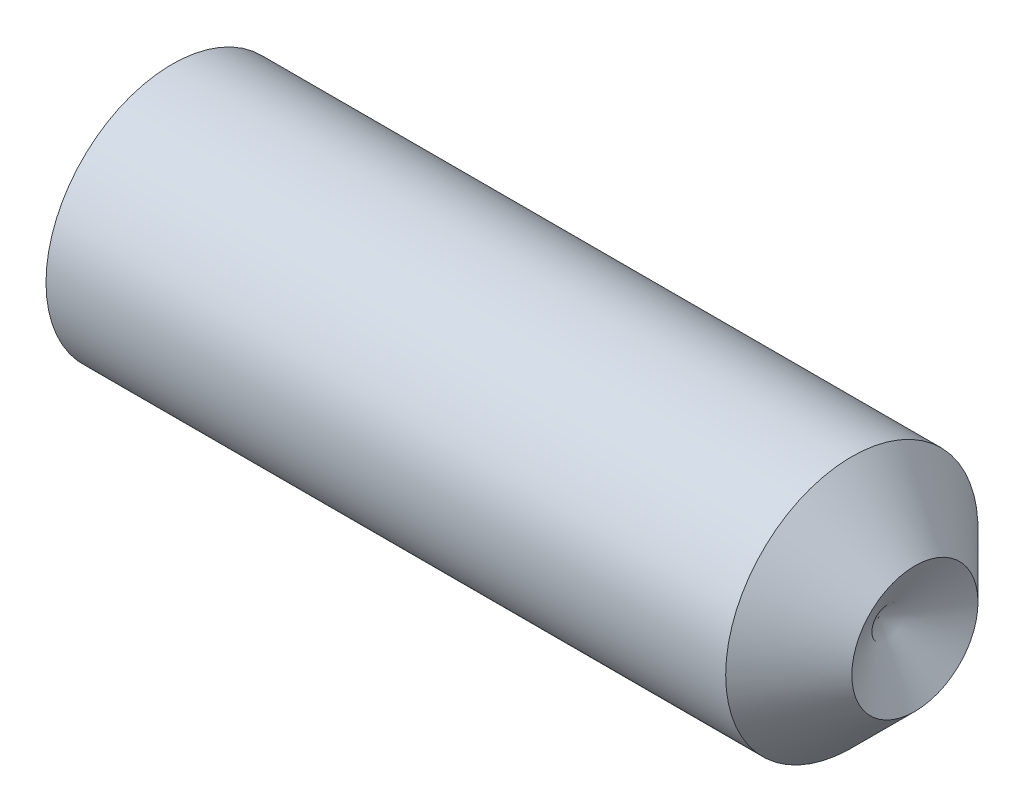
ISO-10303-21;
HEADER;
FILE_DESCRIPTION(('STEP AP214'),'2;1');
FILE_NAME('part.step','',(''),(''),'','','');
FILE_SCHEMA(('AUTOMOTIVE_DESIGN { 1 0 10303 214 1 1 1 1 }'));
ENDSEC;
DATA;
#1=APPLICATION_CONTEXT('core data for automotive mechanical design processes');
#2=APPLICATION_PROTOCOL_DEFINITION('international standard','automotive_design',2000,#1);
#3=PRODUCT_CONTEXT('',#1,'mechanical');
#4=PRODUCT('Part','Part','',(#3));
#5=PRODUCT_RELATED_PRODUCT_CATEGORY('part','',(#4));
#6=PRODUCT_DEFINITION_FORMATION('','',#4);
#7=PRODUCT_DEFINITION_CONTEXT('part definition',#1,'design');
#8=PRODUCT_DEFINITION('design','',#6,#7);
#9=PRODUCT_DEFINITION_SHAPE('','',#8);
#10=(LENGTH_UNIT() NAMED_UNIT(*) SI_UNIT(.MILLI.,.METRE.));
#11=(NAMED_UNIT(*) PLANE_ANGLE_UNIT() SI_UNIT($,.RADIAN.));
#12=(NAMED_UNIT(*) SI_UNIT($,.STERADIAN.) SOLID_ANGLE_UNIT());
#13=UNCERTAINTY_MEASURE_WITH_UNIT(LENGTH_MEASURE(1.E-05),#10,'distance_accuracy_value','');
#14=(GEOMETRIC_REPRESENTATION_CONTEXT(3) GLOBAL_UNCERTAINTY_ASSIGNED_CONTEXT((#13)) GLOBAL_UNIT_ASSIGNED_CONTEXT((#10,
#11,#12)) REPRESENTATION_CONTEXT('',''));
#15=CARTESIAN_POINT('',(0.,0.,0.));
#16=DIRECTION('',(0.,0.,1.));
#17=DIRECTION('',(1.,0.,0.));
#18=AXIS2_PLACEMENT_3D('',#15,#16,#17);
#19=CARTESIAN_POINT('',(0.,0.,0.));
#20=DIRECTION('',(-1.,0.,0.));
#21=DIRECTION('',(0.,0.,1.));
#22=AXIS2_PLACEMENT_3D('',#19,#20,#21);
#23=PLANE('',#22);
#24=CARTESIAN_POINT('',(0.,0.,0.));
#25=DIRECTION('',(-1.,0.,0.));
#26=DIRECTION('',(0.,0.,1.));
#27=AXIS2_PLACEMENT_3D('',#24,#25,#26);
#28=CIRCLE('',#27,1.61);
#29=CARTESIAN_POINT('',(0.,0.,1.61));
#30=VERTEX_POINT('',#29);
#31=EDGE_CURVE('E11',#30,#30,#28,.T.);
#32=ORIENTED_EDGE('',*,*,#31,.T.);
#33=EDGE_LOOP('',(#32));
#34=FACE_BOUND('',#33,.T.);
#35=DIRECTION('',(0.,0.,-1.));
#36=VECTOR('',#35,1.);
#37=CARTESIAN_POINT('',(0.,1.,0.577350269189623));
#38=LINE('',#37,#36);
#39=CARTESIAN_POINT('',(0.,1.,0.577350269189623));
#40=VERTEX_POINT('',#39);
#41=CARTESIAN_POINT('',(0.,1.,-0.577350269189629));
#42=VERTEX_POINT('',#41);
#43=EDGE_CURVE('E95',#40,#42,#38,.T.);
#44=ORIENTED_EDGE('',*,*,#43,.F.);
#45=DIRECTION('',(0.,-0.866025403784439,0.5));
#46=VECTOR('',#45,1.);
#47=CARTESIAN_POINT('',(0.,1.,0.577350269189623));
#48=LINE('',#47,#46);
#49=CARTESIAN_POINT('',(0.,0.,1.15470053837925));
#50=VERTEX_POINT('',#49);
#51=EDGE_CURVE('E48',#40,#50,#48,.T.);
#52=ORIENTED_EDGE('',*,*,#51,.T.);
#53=DIRECTION('',(0.,0.866025403784439,0.5));
#54=VECTOR('',#53,1.);
#55=CARTESIAN_POINT('',(0.,-0.999999999999997,0.577350269189623));
#56=LINE('',#55,#54);
#57=CARTESIAN_POINT('',(0.,-0.999999999999997,0.577350269189623));
#58=VERTEX_POINT('',#57);
#59=EDGE_CURVE('E101',#58,#50,#56,.T.);
#60=ORIENTED_EDGE('',*,*,#59,.F.);
#61=DIRECTION('',(0.,0.,-1.));
#62=VECTOR('',#61,1.);
#63=CARTESIAN_POINT('',(0.,-0.999999999999997,0.577350269189623));
#64=LINE('',#63,#62);
#65=CARTESIAN_POINT('',(0.,-0.999999999999997,-0.577350269189628));
#66=VERTEX_POINT('',#65);
#67=EDGE_CURVE('E121',#58,#66,#64,.T.);
#68=ORIENTED_EDGE('',*,*,#67,.T.);
#69=DIRECTION('',(0.,0.866025403784439,-0.5));
#70=VECTOR('',#69,1.);
#71=CARTESIAN_POINT('',(0.,-0.999999999999997,-0.577350269189628));
#72=LINE('',#71,#70);
#73=CARTESIAN_POINT('',(0.,0.,-1.15470053837925));
#74=VERTEX_POINT('',#73);
#75=EDGE_CURVE('E124',#66,#74,#72,.T.);
#76=ORIENTED_EDGE('',*,*,#75,.T.);
#77=DIRECTION('',(0.,-0.866025403784439,-0.499999999999999));
#78=VECTOR('',#77,1.);
#79=CARTESIAN_POINT('',(0.,1.,-0.577350269189629));
#80=LINE('',#79,#78);
#81=EDGE_CURVE('E127',#42,#74,#80,.T.);
#82=ORIENTED_EDGE('',*,*,#81,.F.);
#83=EDGE_LOOP('',(#44,#52,#60,#68,#76,#82));
#84=FACE_BOUND('',#83,.T.);
#85=ADVANCED_FACE('F34',(#34,#84),#23,.T.);
#86=CARTESIAN_POINT('',(0.,0.,0.));
#87=DIRECTION('',(1.,0.,0.));
#88=DIRECTION('',(0.,0.,-1.));
#89=AXIS2_PLACEMENT_3D('',#86,#87,#88);
#90=CONICAL_SURFACE('',#89,1.61,1.0471975511966);
#91=CARTESIAN_POINT('',(0.225166604983952,0.,0.));
#92=DIRECTION('',(-1.,0.,0.));
#93=DIRECTION('',(0.,0.,1.));
#94=AXIS2_PLACEMENT_3D('',#91,#92,#93);
#95=CIRCLE('',#94,2.);
#96=CARTESIAN_POINT('',(0.225166604983952,0.,2.));
#97=VERTEX_POINT('',#96);
#98=EDGE_CURVE('E41',#97,#97,#95,.T.);
#99=ORIENTED_EDGE('',*,*,#98,.T.);
#100=EDGE_LOOP('',(#99));
#101=FACE_BOUND('',#100,.T.);
#102=ORIENTED_EDGE('',*,*,#31,.F.);
#103=EDGE_LOOP('',(#102));
#104=FACE_BOUND('',#103,.T.);
#105=ADVANCED_FACE('F147',(#101,#104),#90,.T.);
#106=CARTESIAN_POINT('',(-12.7,0.,0.));
#107=DIRECTION('',(-1.,0.,0.));
#108=DIRECTION('',(0.,0.,1.));
#109=AXIS2_PLACEMENT_3D('',#106,#107,#108);
#110=CYLINDRICAL_SURFACE('',#109,2.);
#111=CARTESIAN_POINT('',(11.,0.,0.));
#112=DIRECTION('',(-1.,0.,0.));
#113=DIRECTION('',(0.,0.,1.));
#114=AXIS2_PLACEMENT_3D('',#111,#112,#113);
#115=CIRCLE('',#114,2.);
#116=CARTESIAN_POINT('',(11.,0.,2.));
#117=VERTEX_POINT('',#116);
#118=EDGE_CURVE('E142',#117,#117,#115,.T.);
#119=ORIENTED_EDGE('',*,*,#118,.T.);
#120=EDGE_LOOP('',(#119));
#121=FACE_BOUND('',#120,.T.);
#122=ORIENTED_EDGE('',*,*,#98,.F.);
#123=EDGE_LOOP('',(#122));
#124=FACE_BOUND('',#123,.T.);
#125=ADVANCED_FACE('F150',(#121,#124),#110,.T.);
#126=CARTESIAN_POINT('',(11.,0.,0.));
#127=DIRECTION('',(-1.,0.,0.));
#128=DIRECTION('',(0.,0.,1.));
#129=AXIS2_PLACEMENT_3D('',#126,#127,#128);
#130=CONICAL_SURFACE('',#129,2.,0.785398163397451);
#131=CARTESIAN_POINT('',(12.,0.,0.));
#132=DIRECTION('',(-1.,0.,0.));
#133=DIRECTION('',(0.,0.,1.));
#134=AXIS2_PLACEMENT_3D('',#131,#132,#133);
#135=CIRCLE('',#134,1.);
#136=CARTESIAN_POINT('',(12.,0.,1.));
#137=VERTEX_POINT('',#136);
#138=EDGE_CURVE('E102',#137,#137,#135,.T.);
#139=ORIENTED_EDGE('',*,*,#138,.T.);
#140=EDGE_LOOP('',(#139));
#141=FACE_BOUND('',#140,.T.);
#142=ORIENTED_EDGE('',*,*,#118,.F.);
#143=EDGE_LOOP('',(#142));
#144=FACE_BOUND('',#143,.T.);
#145=ADVANCED_FACE('F152',(#141,#144),#130,.T.);
#146=CARTESIAN_POINT('',(11.4226497308104,0.,0.));
#147=DIRECTION('',(1.,0.,0.));
#148=DIRECTION('',(0.,0.,-1.));
#149=AXIS2_PLACEMENT_3D('',#146,#147,#148);
#150=CONICAL_SURFACE('',#149,0.,1.04719755119659);
#151=ORIENTED_EDGE('',*,*,#138,.F.);
#152=EDGE_LOOP('',(#151));
#153=FACE_BOUND('',#152,.T.);
#154=CARTESIAN_POINT('',(11.4226497308104,0.,0.));
#155=VERTEX_POINT('',#154);
#156=VERTEX_LOOP('',#155);
#157=FACE_BOUND('',#156,.T.);
#158=ADVANCED_FACE('F159',(#153,#157),#150,.F.);
#159=CARTESIAN_POINT('',(2.5,1.,0.577350269189623));
#160=DIRECTION('',(0.,-0.5,-0.866025403784439));
#161=DIRECTION('',(0.,0.866025403784439,-0.5));
#162=AXIS2_PLACEMENT_3D('',#159,#160,#161);
#163=PLANE('',#162);
#164=ORIENTED_EDGE('',*,*,#51,.F.);
#165=DIRECTION('',(-1.,0.,0.));
#166=VECTOR('',#165,1.);
#167=CARTESIAN_POINT('',(2.5,1.,0.577350269189623));
#168=LINE('',#167,#166);
#169=CARTESIAN_POINT('',(2.5,1.,0.577350269189623));
#170=VERTEX_POINT('',#169);
#171=EDGE_CURVE('E89',#170,#40,#168,.T.);
#172=ORIENTED_EDGE('',*,*,#171,.F.);
#173=DIRECTION('',(0.,-0.866025403784439,0.5));
#174=VECTOR('',#173,1.);
#175=CARTESIAN_POINT('',(2.5,1.,0.577350269189623));
#176=LINE('',#175,#174);
#177=CARTESIAN_POINT('',(2.5,0.,1.15470053837925));
#178=VERTEX_POINT('',#177);
#179=EDGE_CURVE('E84',#170,#178,#176,.T.);
#180=ORIENTED_EDGE('',*,*,#179,.T.);
#181=DIRECTION('',(-1.,0.,0.));
#182=VECTOR('',#181,1.);
#183=CARTESIAN_POINT('',(2.5,0.,1.15470053837925));
#184=LINE('',#183,#182);
#185=EDGE_CURVE('E87',#178,#50,#184,.T.);
#186=ORIENTED_EDGE('',*,*,#185,.T.);
#187=EDGE_LOOP('',(#164,#172,#180,#186));
#188=FACE_BOUND('',#187,.T.);
#189=ADVANCED_FACE('F86',(#188),#163,.T.);
#190=CARTESIAN_POINT('',(2.5,-0.999999999999997,0.577350269189623));
#191=DIRECTION('',(0.,-0.5,0.866025403784439));
#192=DIRECTION('',(0.,-0.866025403784439,-0.5));
#193=AXIS2_PLACEMENT_3D('',#190,#191,#192);
#194=PLANE('',#193);
#195=ORIENTED_EDGE('',*,*,#59,.T.);
#196=ORIENTED_EDGE('',*,*,#185,.F.);
#197=DIRECTION('',(0.,0.866025403784439,0.5));
#198=VECTOR('',#197,1.);
#199=CARTESIAN_POINT('',(2.5,-0.999999999999997,0.577350269189623));
#200=LINE('',#199,#198);
#201=CARTESIAN_POINT('',(2.5,-0.999999999999997,0.577350269189623));
#202=VERTEX_POINT('',#201);
#203=EDGE_CURVE('E94',#202,#178,#200,.T.);
#204=ORIENTED_EDGE('',*,*,#203,.F.);
#205=DIRECTION('',(-1.,0.,0.));
#206=VECTOR('',#205,1.);
#207=CARTESIAN_POINT('',(2.5,-0.999999999999997,0.577350269189623));
#208=LINE('',#207,#206);
#209=EDGE_CURVE('E103',#202,#58,#208,.T.);
#210=ORIENTED_EDGE('',*,*,#209,.T.);
#211=EDGE_LOOP('',(#195,#196,#204,#210));
#212=FACE_BOUND('',#211,.T.);
#213=ADVANCED_FACE('F99',(#212),#194,.F.);
#214=CARTESIAN_POINT('',(2.5,-0.999999999999997,0.577350269189623));
#215=DIRECTION('',(0.,1.,0.));
#216=DIRECTION('',(0.,0.,1.));
#217=AXIS2_PLACEMENT_3D('',#214,#215,#216);
#218=PLANE('',#217);
#219=ORIENTED_EDGE('',*,*,#67,.F.);
#220=ORIENTED_EDGE('',*,*,#209,.F.);
#221=DIRECTION('',(0.,0.,-1.));
#222=VECTOR('',#221,1.);
#223=CARTESIAN_POINT('',(2.5,-0.999999999999997,0.577350269189623));
#224=LINE('',#223,#222);
#225=CARTESIAN_POINT('',(2.5,-0.999999999999997,-0.577350269189628));
#226=VERTEX_POINT('',#225);
#227=EDGE_CURVE('E108',#202,#226,#224,.T.);
#228=ORIENTED_EDGE('',*,*,#227,.T.);
#229=DIRECTION('',(-1.,0.,0.));
#230=VECTOR('',#229,1.);
#231=CARTESIAN_POINT('',(2.5,-0.999999999999997,-0.577350269189628));
#232=LINE('',#231,#230);
#233=EDGE_CURVE('E137',#226,#66,#232,.T.);
#234=ORIENTED_EDGE('',*,*,#233,.T.);
#235=EDGE_LOOP('',(#219,#220,#228,#234));
#236=FACE_BOUND('',#235,.T.);
#237=ADVANCED_FACE('F182',(#236),#218,.T.);
#238=CARTESIAN_POINT('',(2.5,-0.999999999999997,-0.577350269189628));
#239=DIRECTION('',(0.,0.5,0.866025403784439));
#240=DIRECTION('',(0.,-0.866025403784439,0.5));
#241=AXIS2_PLACEMENT_3D('',#238,#239,#240);
#242=PLANE('',#241);
#243=ORIENTED_EDGE('',*,*,#75,.F.);
#244=ORIENTED_EDGE('',*,*,#233,.F.);
#245=DIRECTION('',(0.,0.866025403784439,-0.5));
#246=VECTOR('',#245,1.);
#247=CARTESIAN_POINT('',(2.5,-0.999999999999997,-0.577350269189628));
#248=LINE('',#247,#246);
#249=CARTESIAN_POINT('',(2.5,0.,-1.15470053837925));
#250=VERTEX_POINT('',#249);
#251=EDGE_CURVE('E110',#226,#250,#248,.T.);
#252=ORIENTED_EDGE('',*,*,#251,.T.);
#253=DIRECTION('',(-1.,0.,0.));
#254=VECTOR('',#253,1.);
#255=CARTESIAN_POINT('',(2.5,0.,-1.15470053837925));
#256=LINE('',#255,#254);
#257=EDGE_CURVE('E135',#250,#74,#256,.T.);
#258=ORIENTED_EDGE('',*,*,#257,.T.);
#259=EDGE_LOOP('',(#243,#244,#252,#258));
#260=FACE_BOUND('',#259,.T.);
#261=ADVANCED_FACE('F178',(#260),#242,.T.);
#262=CARTESIAN_POINT('',(2.5,1.,-0.577350269189629));
#263=DIRECTION('',(0.,0.5,-0.866025403784439));
#264=DIRECTION('',(0.,0.866025403784439,0.5));
#265=AXIS2_PLACEMENT_3D('',#262,#263,#264);
#266=PLANE('',#265);
#267=ORIENTED_EDGE('',*,*,#81,.T.);
#268=ORIENTED_EDGE('',*,*,#257,.F.);
#269=DIRECTION('',(0.,-0.866025403784439,-0.499999999999999));
#270=VECTOR('',#269,1.);
#271=CARTESIAN_POINT('',(2.5,1.,-0.577350269189629));
#272=LINE('',#271,#270);
#273=CARTESIAN_POINT('',(2.5,1.,-0.577350269189629));
#274=VERTEX_POINT('',#273);
#275=EDGE_CURVE('E114',#274,#250,#272,.T.);
#276=ORIENTED_EDGE('',*,*,#275,.F.);
#277=DIRECTION('',(-1.,0.,0.));
#278=VECTOR('',#277,1.);
#279=CARTESIAN_POINT('',(2.5,1.,-0.577350269189629));
#280=LINE('',#279,#278);
#281=EDGE_CURVE('E133',#274,#42,#280,.T.);
#282=ORIENTED_EDGE('',*,*,#281,.T.);
#283=EDGE_LOOP('',(#267,#268,#276,#282));
#284=FACE_BOUND('',#283,.T.);
#285=ADVANCED_FACE('F175',(#284),#266,.F.);
#286=CARTESIAN_POINT('',(2.5,1.,0.577350269189623));
#287=DIRECTION('',(0.,1.,0.));
#288=DIRECTION('',(0.,0.,1.));
#289=AXIS2_PLACEMENT_3D('',#286,#287,#288);
#290=PLANE('',#289);
#291=ORIENTED_EDGE('',*,*,#43,.T.);
#292=ORIENTED_EDGE('',*,*,#281,.F.);
#293=DIRECTION('',(0.,0.,-1.));
#294=VECTOR('',#293,1.);
#295=CARTESIAN_POINT('',(2.5,1.,0.577350269189623));
#296=LINE('',#295,#294);
#297=EDGE_CURVE('E117',#170,#274,#296,.T.);
#298=ORIENTED_EDGE('',*,*,#297,.F.);
#299=ORIENTED_EDGE('',*,*,#171,.T.);
#300=EDGE_LOOP('',(#291,#292,#298,#299));
#301=FACE_BOUND('',#300,.T.);
#302=ADVANCED_FACE('F171',(#301),#290,.F.);
#303=CARTESIAN_POINT('',(2.5,-0.999999999999997,1.73205080756887));
#304=DIRECTION('',(1.,0.,0.));
#305=DIRECTION('',(0.,0.,-1.));
#306=AXIS2_PLACEMENT_3D('',#303,#304,#305);
#307=PLANE('',#306);
#308=ORIENTED_EDGE('',*,*,#179,.F.);
#309=ORIENTED_EDGE('',*,*,#297,.T.);
#310=ORIENTED_EDGE('',*,*,#275,.T.);
#311=ORIENTED_EDGE('',*,*,#251,.F.);
#312=ORIENTED_EDGE('',*,*,#227,.F.);
#313=ORIENTED_EDGE('',*,*,#203,.T.);
#314=EDGE_LOOP('',(#308,#309,#310,#311,#312,#313));
#315=FACE_BOUND('',#314,.T.);
#316=ADVANCED_FACE('F106',(#315),#307,.F.);
#317=CLOSED_SHELL('',(#85,#105,#125,#145,#158,#189,#213,#237,#261,#285,#302,#316));
#318=MANIFOLD_SOLID_BREP('B2',#317);
#319=ADVANCED_BREP_SHAPE_REPRESENTATION('',(#18,#318),#14);
#320=SHAPE_DEFINITION_REPRESENTATION(#9,#319);
ENDSEC;
END-ISO-10303-21;
